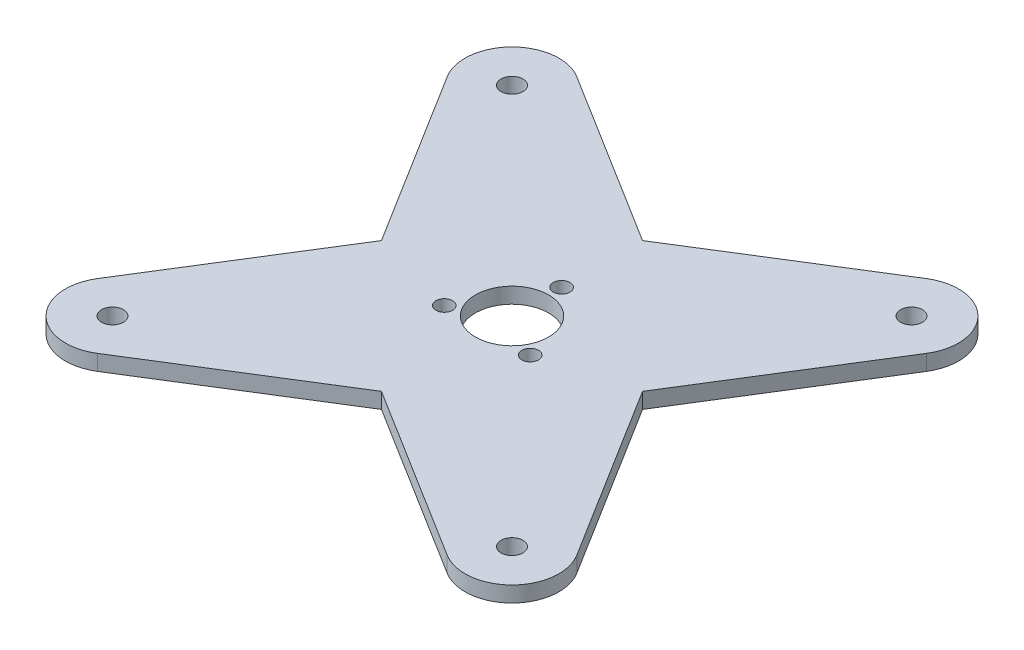
ISO-10303-21;
HEADER;
FILE_DESCRIPTION(('STEP AP214'),'2;1');
FILE_NAME('part.step','',(''),(''),'','','');
FILE_SCHEMA(('AUTOMOTIVE_DESIGN { 1 0 10303 214 1 1 1 1 }'));
ENDSEC;
DATA;
#1=APPLICATION_CONTEXT('core data for automotive mechanical design processes');
#2=APPLICATION_PROTOCOL_DEFINITION('international standard','automotive_design',2000,#1);
#3=PRODUCT_CONTEXT('',#1,'mechanical');
#4=PRODUCT('Part','Part','',(#3));
#5=PRODUCT_RELATED_PRODUCT_CATEGORY('part','',(#4));
#6=PRODUCT_DEFINITION_FORMATION('','',#4);
#7=PRODUCT_DEFINITION_CONTEXT('part definition',#1,'design');
#8=PRODUCT_DEFINITION('design','',#6,#7);
#9=PRODUCT_DEFINITION_SHAPE('','',#8);
#10=(LENGTH_UNIT() NAMED_UNIT(*) SI_UNIT(.MILLI.,.METRE.));
#11=(NAMED_UNIT(*) PLANE_ANGLE_UNIT() SI_UNIT($,.RADIAN.));
#12=(NAMED_UNIT(*) SI_UNIT($,.STERADIAN.) SOLID_ANGLE_UNIT());
#13=UNCERTAINTY_MEASURE_WITH_UNIT(LENGTH_MEASURE(1.E-05),#10,'distance_accuracy_value','');
#14=(GEOMETRIC_REPRESENTATION_CONTEXT(3) GLOBAL_UNCERTAINTY_ASSIGNED_CONTEXT((#13)) GLOBAL_UNIT_ASSIGNED_CONTEXT((#10,
#11,#12)) REPRESENTATION_CONTEXT('',''));
#15=CARTESIAN_POINT('',(0.,0.,0.));
#16=DIRECTION('',(0.,0.,1.));
#17=DIRECTION('',(1.,0.,0.));
#18=AXIS2_PLACEMENT_3D('',#15,#16,#17);
#19=CARTESIAN_POINT('',(-38.25,3.,-38.25));
#20=DIRECTION('',(0.,1.,0.));
#21=DIRECTION('',(0.,0.,1.));
#22=AXIS2_PLACEMENT_3D('',#19,#20,#21);
#23=PLANE('',#22);
#24=CARTESIAN_POINT('',(-8.22724133595217,3.,4.75));
#25=DIRECTION('',(0.,1.,0.));
#26=DIRECTION('',(0.,0.,1.));
#27=AXIS2_PLACEMENT_3D('',#24,#25,#26);
#28=CIRCLE('',#27,1.6);
#29=CARTESIAN_POINT('',(-8.22724133595217,3.,6.35000000000001));
#30=VERTEX_POINT('',#29);
#31=EDGE_CURVE('E340',#30,#30,#28,.T.);
#32=ORIENTED_EDGE('',*,*,#31,.F.);
#33=EDGE_LOOP('',(#32));
#34=FACE_BOUND('',#33,.T.);
#35=CARTESIAN_POINT('',(8.22724133595217,3.,4.75));
#36=DIRECTION('',(0.,1.,0.));
#37=DIRECTION('',(0.,0.,1.));
#38=AXIS2_PLACEMENT_3D('',#35,#36,#37);
#39=CIRCLE('',#38,1.6);
#40=CARTESIAN_POINT('',(8.22724133595217,3.,6.35));
#41=VERTEX_POINT('',#40);
#42=EDGE_CURVE('E336',#41,#41,#39,.T.);
#43=ORIENTED_EDGE('',*,*,#42,.F.);
#44=EDGE_LOOP('',(#43));
#45=FACE_BOUND('',#44,.T.);
#46=CARTESIAN_POINT('',(0.,3.,-9.5));
#47=DIRECTION('',(0.,1.,0.));
#48=DIRECTION('',(0.,0.,1.));
#49=AXIS2_PLACEMENT_3D('',#46,#47,#48);
#50=CIRCLE('',#49,1.6);
#51=CARTESIAN_POINT('',(0.,3.,-7.9));
#52=VERTEX_POINT('',#51);
#53=EDGE_CURVE('E329',#52,#52,#50,.T.);
#54=ORIENTED_EDGE('',*,*,#53,.F.);
#55=EDGE_LOOP('',(#54));
#56=FACE_BOUND('',#55,.T.);
#57=CARTESIAN_POINT('',(0.,3.,0.));
#58=DIRECTION('',(0.,1.,0.));
#59=DIRECTION('',(0.,0.,1.));
#60=AXIS2_PLACEMENT_3D('',#57,#58,#59);
#61=CIRCLE('',#60,7.);
#62=CARTESIAN_POINT('',(0.,3.,7.));
#63=VERTEX_POINT('',#62);
#64=EDGE_CURVE('E209',#63,#63,#61,.T.);
#65=ORIENTED_EDGE('',*,*,#64,.F.);
#66=EDGE_LOOP('',(#65));
#67=FACE_BOUND('',#66,.T.);
#68=CARTESIAN_POINT('',(38.25,3.,38.25));
#69=DIRECTION('',(0.,1.,0.));
#70=DIRECTION('',(0.,0.,1.));
#71=AXIS2_PLACEMENT_3D('',#68,#69,#70);
#72=CIRCLE('',#71,2.1);
#73=CARTESIAN_POINT('',(38.25,3.,40.35));
#74=VERTEX_POINT('',#73);
#75=EDGE_CURVE('E229',#74,#74,#72,.T.);
#76=ORIENTED_EDGE('',*,*,#75,.F.);
#77=EDGE_LOOP('',(#76));
#78=FACE_BOUND('',#77,.T.);
#79=CARTESIAN_POINT('',(38.25,3.,-38.25));
#80=DIRECTION('',(0.,1.,0.));
#81=DIRECTION('',(0.,0.,1.));
#82=AXIS2_PLACEMENT_3D('',#79,#80,#81);
#83=CIRCLE('',#82,2.1);
#84=CARTESIAN_POINT('',(38.25,3.,-36.15));
#85=VERTEX_POINT('',#84);
#86=EDGE_CURVE('E162',#85,#85,#83,.T.);
#87=ORIENTED_EDGE('',*,*,#86,.F.);
#88=EDGE_LOOP('',(#87));
#89=FACE_BOUND('',#88,.T.);
#90=CARTESIAN_POINT('',(-38.25,3.,-38.25));
#91=DIRECTION('',(0.,1.,0.));
#92=DIRECTION('',(0.,0.,1.));
#93=AXIS2_PLACEMENT_3D('',#90,#91,#92);
#94=CIRCLE('',#93,9.);
#95=CARTESIAN_POINT('',(-33.4870671074262,3.,-45.8863911804489));
#96=VERTEX_POINT('',#95);
#97=CARTESIAN_POINT('',(-45.8863911804489,3.,-33.4870671074262));
#98=VERTEX_POINT('',#97);
#99=EDGE_CURVE('E181',#96,#98,#94,.T.);
#100=ORIENTED_EDGE('',*,*,#99,.T.);
#101=DIRECTION('',(0.529214765841535,0.,0.848487908938772));
#102=VECTOR('',#101,1.);
#103=CARTESIAN_POINT('',(-45.8863911804489,3.,-33.4870671074262));
#104=LINE('',#103,#102);
#105=CARTESIAN_POINT('',(-25.,3.,0.));
#106=VERTEX_POINT('',#105);
#107=EDGE_CURVE('E109',#98,#106,#104,.T.);
#108=ORIENTED_EDGE('',*,*,#107,.T.);
#109=DIRECTION('',(-0.529214765841535,0.,0.848487908938772));
#110=VECTOR('',#109,1.);
#111=CARTESIAN_POINT('',(-45.8863911804489,3.,33.4870671074262));
#112=LINE('',#111,#110);
#113=CARTESIAN_POINT('',(-45.8863911804489,3.,33.4870671074262));
#114=VERTEX_POINT('',#113);
#115=EDGE_CURVE('E247',#106,#114,#112,.T.);
#116=ORIENTED_EDGE('',*,*,#115,.T.);
#117=CARTESIAN_POINT('',(-38.25,3.,38.25));
#118=DIRECTION('',(0.,1.,0.));
#119=DIRECTION('',(0.,0.,1.));
#120=AXIS2_PLACEMENT_3D('',#117,#118,#119);
#121=CIRCLE('',#120,9.);
#122=CARTESIAN_POINT('',(-33.4870671074262,3.,45.886391180449));
#123=VERTEX_POINT('',#122);
#124=EDGE_CURVE('E249',#114,#123,#121,.T.);
#125=ORIENTED_EDGE('',*,*,#124,.T.);
#126=DIRECTION('',(0.848487908938771,0.,-0.529214765841535));
#127=VECTOR('',#126,1.);
#128=CARTESIAN_POINT('',(-33.4870671074262,3.,45.886391180449));
#129=LINE('',#128,#127);
#130=CARTESIAN_POINT('',(0.,3.,25.));
#131=VERTEX_POINT('',#130);
#132=EDGE_CURVE('E251',#123,#131,#129,.T.);
#133=ORIENTED_EDGE('',*,*,#132,.T.);
#134=DIRECTION('',(0.848487908938772,0.,0.529214765841535));
#135=VECTOR('',#134,1.);
#136=CARTESIAN_POINT('',(33.4870671074262,3.,45.8863911804489));
#137=LINE('',#136,#135);
#138=CARTESIAN_POINT('',(33.4870671074262,3.,45.8863911804489));
#139=VERTEX_POINT('',#138);
#140=EDGE_CURVE('E253',#131,#139,#137,.T.);
#141=ORIENTED_EDGE('',*,*,#140,.T.);
#142=CARTESIAN_POINT('',(38.25,3.,38.25));
#143=DIRECTION('',(0.,1.,0.));
#144=DIRECTION('',(0.,0.,1.));
#145=AXIS2_PLACEMENT_3D('',#142,#143,#144);
#146=CIRCLE('',#145,9.);
#147=CARTESIAN_POINT('',(45.886391180449,3.,33.4870671074262));
#148=VERTEX_POINT('',#147);
#149=EDGE_CURVE('E255',#139,#148,#146,.T.);
#150=ORIENTED_EDGE('',*,*,#149,.T.);
#151=DIRECTION('',(-0.529214765841535,0.,-0.848487908938772));
#152=VECTOR('',#151,1.);
#153=CARTESIAN_POINT('',(45.886391180449,3.,33.4870671074262));
#154=LINE('',#153,#152);
#155=CARTESIAN_POINT('',(25.,3.,0.));
#156=VERTEX_POINT('',#155);
#157=EDGE_CURVE('E257',#148,#156,#154,.T.);
#158=ORIENTED_EDGE('',*,*,#157,.T.);
#159=DIRECTION('',(0.529214765841535,0.,-0.848487908938772));
#160=VECTOR('',#159,1.);
#161=CARTESIAN_POINT('',(45.886391180449,3.,-33.4870671074262));
#162=LINE('',#161,#160);
#163=CARTESIAN_POINT('',(45.8863911804489,3.,-33.4870671074262));
#164=VERTEX_POINT('',#163);
#165=EDGE_CURVE('E140',#156,#164,#162,.T.);
#166=ORIENTED_EDGE('',*,*,#165,.T.);
#167=CARTESIAN_POINT('',(38.25,3.,-38.25));
#168=DIRECTION('',(0.,1.,0.));
#169=DIRECTION('',(0.,0.,1.));
#170=AXIS2_PLACEMENT_3D('',#167,#168,#169);
#171=CIRCLE('',#170,9.);
#172=CARTESIAN_POINT('',(33.4870671074262,3.,-45.8863911804489));
#173=VERTEX_POINT('',#172);
#174=EDGE_CURVE('E134',#164,#173,#171,.T.);
#175=ORIENTED_EDGE('',*,*,#174,.T.);
#176=DIRECTION('',(-0.848487908938772,0.,0.529214765841535));
#177=VECTOR('',#176,1.);
#178=CARTESIAN_POINT('',(33.4870671074262,3.,-45.8863911804489));
#179=LINE('',#178,#177);
#180=CARTESIAN_POINT('',(0.,3.,-25.));
#181=VERTEX_POINT('',#180);
#182=EDGE_CURVE('E138',#173,#181,#179,.T.);
#183=ORIENTED_EDGE('',*,*,#182,.T.);
#184=DIRECTION('',(-0.848487908938772,0.,-0.529214765841535));
#185=VECTOR('',#184,1.);
#186=CARTESIAN_POINT('',(-33.4870671074262,3.,-45.8863911804489));
#187=LINE('',#186,#185);
#188=EDGE_CURVE('E54',#181,#96,#187,.T.);
#189=ORIENTED_EDGE('',*,*,#188,.T.);
#190=EDGE_LOOP('',(#100,#108,#116,#125,#133,#141,#150,#158,#166,#175,#183,#189));
#191=FACE_BOUND('',#190,.T.);
#192=CARTESIAN_POINT('',(-38.25,3.,38.25));
#193=DIRECTION('',(0.,1.,0.));
#194=DIRECTION('',(0.,0.,1.));
#195=AXIS2_PLACEMENT_3D('',#192,#193,#194);
#196=CIRCLE('',#195,2.1);
#197=CARTESIAN_POINT('',(-38.25,3.,40.35));
#198=VERTEX_POINT('',#197);
#199=EDGE_CURVE('E235',#198,#198,#196,.T.);
#200=ORIENTED_EDGE('',*,*,#199,.F.);
#201=EDGE_LOOP('',(#200));
#202=FACE_BOUND('',#201,.T.);
#203=CARTESIAN_POINT('',(-38.25,3.,-38.25));
#204=DIRECTION('',(0.,1.,0.));
#205=DIRECTION('',(0.,0.,1.));
#206=AXIS2_PLACEMENT_3D('',#203,#204,#205);
#207=CIRCLE('',#206,2.1);
#208=CARTESIAN_POINT('',(-38.25,3.,-36.15));
#209=VERTEX_POINT('',#208);
#210=EDGE_CURVE('E220',#209,#209,#207,.T.);
#211=ORIENTED_EDGE('',*,*,#210,.F.);
#212=EDGE_LOOP('',(#211));
#213=FACE_BOUND('',#212,.T.);
#214=ADVANCED_FACE('F35',(#34,#45,#56,#67,#78,#89,#191,#202,#213),#23,.T.);
#215=CARTESIAN_POINT('',(-38.25,0.,-38.25));
#216=DIRECTION('',(0.,1.,0.));
#217=DIRECTION('',(0.,0.,1.));
#218=AXIS2_PLACEMENT_3D('',#215,#216,#217);
#219=PLANE('',#218);
#220=CARTESIAN_POINT('',(-8.22724133595217,0.,4.75));
#221=DIRECTION('',(0.,1.,0.));
#222=DIRECTION('',(0.,0.,1.));
#223=AXIS2_PLACEMENT_3D('',#220,#221,#222);
#224=CIRCLE('',#223,1.6);
#225=CARTESIAN_POINT('',(-8.22724133595217,0.,6.35000000000001));
#226=VERTEX_POINT('',#225);
#227=EDGE_CURVE('E39',#226,#226,#224,.T.);
#228=ORIENTED_EDGE('',*,*,#227,.T.);
#229=EDGE_LOOP('',(#228));
#230=FACE_BOUND('',#229,.T.);
#231=CARTESIAN_POINT('',(8.22724133595217,0.,4.75));
#232=DIRECTION('',(0.,1.,0.));
#233=DIRECTION('',(0.,0.,1.));
#234=AXIS2_PLACEMENT_3D('',#231,#232,#233);
#235=CIRCLE('',#234,1.6);
#236=CARTESIAN_POINT('',(8.22724133595217,0.,6.35));
#237=VERTEX_POINT('',#236);
#238=EDGE_CURVE('E211',#237,#237,#235,.T.);
#239=ORIENTED_EDGE('',*,*,#238,.T.);
#240=EDGE_LOOP('',(#239));
#241=FACE_BOUND('',#240,.T.);
#242=CARTESIAN_POINT('',(0.,0.,-9.5));
#243=DIRECTION('',(0.,1.,0.));
#244=DIRECTION('',(0.,0.,1.));
#245=AXIS2_PLACEMENT_3D('',#242,#243,#244);
#246=CIRCLE('',#245,1.6);
#247=CARTESIAN_POINT('',(0.,0.,-7.9));
#248=VERTEX_POINT('',#247);
#249=EDGE_CURVE('E208',#248,#248,#246,.T.);
#250=ORIENTED_EDGE('',*,*,#249,.T.);
#251=EDGE_LOOP('',(#250));
#252=FACE_BOUND('',#251,.T.);
#253=CARTESIAN_POINT('',(0.,0.,0.));
#254=DIRECTION('',(0.,1.,0.));
#255=DIRECTION('',(0.,0.,1.));
#256=AXIS2_PLACEMENT_3D('',#253,#254,#255);
#257=CIRCLE('',#256,7.);
#258=CARTESIAN_POINT('',(0.,0.,7.));
#259=VERTEX_POINT('',#258);
#260=EDGE_CURVE('E205',#259,#259,#257,.T.);
#261=ORIENTED_EDGE('',*,*,#260,.T.);
#262=EDGE_LOOP('',(#261));
#263=FACE_BOUND('',#262,.T.);
#264=CARTESIAN_POINT('',(-38.25,0.,-38.25));
#265=DIRECTION('',(0.,1.,0.));
#266=DIRECTION('',(0.,0.,1.));
#267=AXIS2_PLACEMENT_3D('',#264,#265,#266);
#268=CIRCLE('',#267,9.);
#269=CARTESIAN_POINT('',(-33.4870671074262,0.,-45.8863911804489));
#270=VERTEX_POINT('',#269);
#271=CARTESIAN_POINT('',(-45.8863911804489,0.,-33.4870671074262));
#272=VERTEX_POINT('',#271);
#273=EDGE_CURVE('E158',#270,#272,#268,.T.);
#274=ORIENTED_EDGE('',*,*,#273,.F.);
#275=DIRECTION('',(-0.848487908938772,0.,-0.529214765841535));
#276=VECTOR('',#275,1.);
#277=CARTESIAN_POINT('',(-33.4870671074262,0.,-45.8863911804489));
#278=LINE('',#277,#276);
#279=CARTESIAN_POINT('',(0.,0.,-25.));
#280=VERTEX_POINT('',#279);
#281=EDGE_CURVE('E101',#280,#270,#278,.T.);
#282=ORIENTED_EDGE('',*,*,#281,.F.);
#283=DIRECTION('',(-0.848487908938772,0.,0.529214765841535));
#284=VECTOR('',#283,1.);
#285=CARTESIAN_POINT('',(33.4870671074262,0.,-45.8863911804489));
#286=LINE('',#285,#284);
#287=CARTESIAN_POINT('',(33.4870671074262,0.,-45.8863911804489));
#288=VERTEX_POINT('',#287);
#289=EDGE_CURVE('E95',#288,#280,#286,.T.);
#290=ORIENTED_EDGE('',*,*,#289,.F.);
#291=CARTESIAN_POINT('',(38.25,0.,-38.25));
#292=DIRECTION('',(0.,1.,0.));
#293=DIRECTION('',(0.,0.,1.));
#294=AXIS2_PLACEMENT_3D('',#291,#292,#293);
#295=CIRCLE('',#294,9.);
#296=CARTESIAN_POINT('',(45.8863911804489,0.,-33.4870671074262));
#297=VERTEX_POINT('',#296);
#298=EDGE_CURVE('E148',#297,#288,#295,.T.);
#299=ORIENTED_EDGE('',*,*,#298,.F.);
#300=DIRECTION('',(0.529214765841535,0.,-0.848487908938772));
#301=VECTOR('',#300,1.);
#302=CARTESIAN_POINT('',(45.886391180449,0.,-33.4870671074262));
#303=LINE('',#302,#301);
#304=CARTESIAN_POINT('',(25.,0.,0.));
#305=VERTEX_POINT('',#304);
#306=EDGE_CURVE('E176',#305,#297,#303,.T.);
#307=ORIENTED_EDGE('',*,*,#306,.F.);
#308=DIRECTION('',(-0.529214765841535,0.,-0.848487908938772));
#309=VECTOR('',#308,1.);
#310=CARTESIAN_POINT('',(45.886391180449,0.,33.4870671074262));
#311=LINE('',#310,#309);
#312=CARTESIAN_POINT('',(45.886391180449,0.,33.4870671074262));
#313=VERTEX_POINT('',#312);
#314=EDGE_CURVE('E174',#313,#305,#311,.T.);
#315=ORIENTED_EDGE('',*,*,#314,.F.);
#316=CARTESIAN_POINT('',(38.25,0.,38.25));
#317=DIRECTION('',(0.,1.,0.));
#318=DIRECTION('',(0.,0.,1.));
#319=AXIS2_PLACEMENT_3D('',#316,#317,#318);
#320=CIRCLE('',#319,9.);
#321=CARTESIAN_POINT('',(33.4870671074262,0.,45.8863911804489));
#322=VERTEX_POINT('',#321);
#323=EDGE_CURVE('E172',#322,#313,#320,.T.);
#324=ORIENTED_EDGE('',*,*,#323,.F.);
#325=DIRECTION('',(0.848487908938772,0.,0.529214765841535));
#326=VECTOR('',#325,1.);
#327=CARTESIAN_POINT('',(33.4870671074262,0.,45.8863911804489));
#328=LINE('',#327,#326);
#329=CARTESIAN_POINT('',(0.,0.,25.));
#330=VERTEX_POINT('',#329);
#331=EDGE_CURVE('E170',#330,#322,#328,.T.);
#332=ORIENTED_EDGE('',*,*,#331,.F.);
#333=DIRECTION('',(0.848487908938771,0.,-0.529214765841535));
#334=VECTOR('',#333,1.);
#335=CARTESIAN_POINT('',(-33.4870671074262,0.,45.886391180449));
#336=LINE('',#335,#334);
#337=CARTESIAN_POINT('',(-33.4870671074262,0.,45.886391180449));
#338=VERTEX_POINT('',#337);
#339=EDGE_CURVE('E168',#338,#330,#336,.T.);
#340=ORIENTED_EDGE('',*,*,#339,.F.);
#341=CARTESIAN_POINT('',(-38.25,0.,38.25));
#342=DIRECTION('',(0.,1.,0.));
#343=DIRECTION('',(0.,0.,1.));
#344=AXIS2_PLACEMENT_3D('',#341,#342,#343);
#345=CIRCLE('',#344,9.);
#346=CARTESIAN_POINT('',(-45.8863911804489,0.,33.4870671074262));
#347=VERTEX_POINT('',#346);
#348=EDGE_CURVE('E166',#347,#338,#345,.T.);
#349=ORIENTED_EDGE('',*,*,#348,.F.);
#350=DIRECTION('',(-0.529214765841535,0.,0.848487908938772));
#351=VECTOR('',#350,1.);
#352=CARTESIAN_POINT('',(-45.8863911804489,0.,33.4870671074262));
#353=LINE('',#352,#351);
#354=CARTESIAN_POINT('',(-25.,0.,0.));
#355=VERTEX_POINT('',#354);
#356=EDGE_CURVE('E164',#355,#347,#353,.T.);
#357=ORIENTED_EDGE('',*,*,#356,.F.);
#358=DIRECTION('',(0.529214765841535,0.,0.848487908938772));
#359=VECTOR('',#358,1.);
#360=CARTESIAN_POINT('',(-45.8863911804489,0.,-33.4870671074262));
#361=LINE('',#360,#359);
#362=EDGE_CURVE('E161',#272,#355,#361,.T.);
#363=ORIENTED_EDGE('',*,*,#362,.F.);
#364=EDGE_LOOP('',(#274,#282,#290,#299,#307,#315,#324,#332,#340,#349,#357,#363));
#365=FACE_BOUND('',#364,.T.);
#366=CARTESIAN_POINT('',(38.25,0.,-38.25));
#367=DIRECTION('',(0.,1.,0.));
#368=DIRECTION('',(0.,0.,1.));
#369=AXIS2_PLACEMENT_3D('',#366,#367,#368);
#370=CIRCLE('',#369,2.1);
#371=CARTESIAN_POINT('',(38.25,0.,-36.15));
#372=VERTEX_POINT('',#371);
#373=EDGE_CURVE('E238',#372,#372,#370,.T.);
#374=ORIENTED_EDGE('',*,*,#373,.T.);
#375=EDGE_LOOP('',(#374));
#376=FACE_BOUND('',#375,.T.);
#377=CARTESIAN_POINT('',(-38.25,0.,38.25));
#378=DIRECTION('',(0.,1.,0.));
#379=DIRECTION('',(0.,0.,1.));
#380=AXIS2_PLACEMENT_3D('',#377,#378,#379);
#381=CIRCLE('',#380,2.1);
#382=CARTESIAN_POINT('',(-38.25,0.,40.35));
#383=VERTEX_POINT('',#382);
#384=EDGE_CURVE('E232',#383,#383,#381,.T.);
#385=ORIENTED_EDGE('',*,*,#384,.T.);
#386=EDGE_LOOP('',(#385));
#387=FACE_BOUND('',#386,.T.);
#388=CARTESIAN_POINT('',(38.25,0.,38.25));
#389=DIRECTION('',(0.,1.,0.));
#390=DIRECTION('',(0.,0.,1.));
#391=AXIS2_PLACEMENT_3D('',#388,#389,#390);
#392=CIRCLE('',#391,2.1);
#393=CARTESIAN_POINT('',(38.25,0.,40.35));
#394=VERTEX_POINT('',#393);
#395=EDGE_CURVE('E225',#394,#394,#392,.T.);
#396=ORIENTED_EDGE('',*,*,#395,.T.);
#397=EDGE_LOOP('',(#396));
#398=FACE_BOUND('',#397,.T.);
#399=CARTESIAN_POINT('',(-38.25,0.,-38.25));
#400=DIRECTION('',(0.,1.,0.));
#401=DIRECTION('',(0.,0.,1.));
#402=AXIS2_PLACEMENT_3D('',#399,#400,#401);
#403=CIRCLE('',#402,2.1);
#404=CARTESIAN_POINT('',(-38.25,0.,-36.15));
#405=VERTEX_POINT('',#404);
#406=EDGE_CURVE('E216',#405,#405,#403,.T.);
#407=ORIENTED_EDGE('',*,*,#406,.T.);
#408=EDGE_LOOP('',(#407));
#409=FACE_BOUND('',#408,.T.);
#410=ADVANCED_FACE('F270',(#230,#241,#252,#263,#365,#376,#387,#398,#409),#219,.F.);
#411=CARTESIAN_POINT('',(-38.25,3.,-38.25));
#412=DIRECTION('',(0.,-1.,0.));
#413=DIRECTION('',(0.,0.,-1.));
#414=AXIS2_PLACEMENT_3D('',#411,#412,#413);
#415=CYLINDRICAL_SURFACE('',#414,9.);
#416=ORIENTED_EDGE('',*,*,#273,.T.);
#417=DIRECTION('',(0.,-1.,0.));
#418=VECTOR('',#417,1.);
#419=CARTESIAN_POINT('',(-45.8863911804489,3.,-33.4870671074262));
#420=LINE('',#419,#418);
#421=EDGE_CURVE('E11',#98,#272,#420,.T.);
#422=ORIENTED_EDGE('',*,*,#421,.F.);
#423=ORIENTED_EDGE('',*,*,#99,.F.);
#424=DIRECTION('',(0.,-1.,0.));
#425=VECTOR('',#424,1.);
#426=CARTESIAN_POINT('',(-33.4870671074262,3.,-45.8863911804489));
#427=LINE('',#426,#425);
#428=EDGE_CURVE('E154',#96,#270,#427,.T.);
#429=ORIENTED_EDGE('',*,*,#428,.T.);
#430=EDGE_LOOP('',(#416,#422,#423,#429));
#431=FACE_BOUND('',#430,.T.);
#432=ADVANCED_FACE('F37',(#431),#415,.T.);
#433=CARTESIAN_POINT('',(-45.8863911804489,3.,-33.4870671074262));
#434=DIRECTION('',(0.848487908938772,0.,-0.529214765841535));
#435=DIRECTION('',(-0.529214765841535,0.,-0.848487908938772));
#436=AXIS2_PLACEMENT_3D('',#433,#434,#435);
#437=PLANE('',#436);
#438=ORIENTED_EDGE('',*,*,#362,.T.);
#439=DIRECTION('',(0.,-1.,0.));
#440=VECTOR('',#439,1.);
#441=CARTESIAN_POINT('',(-25.,3.,0.));
#442=LINE('',#441,#440);
#443=EDGE_CURVE('E45',#106,#355,#442,.T.);
#444=ORIENTED_EDGE('',*,*,#443,.F.);
#445=ORIENTED_EDGE('',*,*,#107,.F.);
#446=ORIENTED_EDGE('',*,*,#421,.T.);
#447=EDGE_LOOP('',(#438,#444,#445,#446));
#448=FACE_BOUND('',#447,.T.);
#449=ADVANCED_FACE('F477',(#448),#437,.F.);
#450=CARTESIAN_POINT('',(-45.8863911804489,3.,33.4870671074262));
#451=DIRECTION('',(0.848487908938771,0.,0.529214765841535));
#452=DIRECTION('',(0.529214765841535,0.,-0.848487908938772));
#453=AXIS2_PLACEMENT_3D('',#450,#451,#452);
#454=PLANE('',#453);
#455=ORIENTED_EDGE('',*,*,#356,.T.);
#456=DIRECTION('',(0.,-1.,0.));
#457=VECTOR('',#456,1.);
#458=CARTESIAN_POINT('',(-45.8863911804489,3.,33.4870671074262));
#459=LINE('',#458,#457);
#460=EDGE_CURVE('E200',#114,#347,#459,.T.);
#461=ORIENTED_EDGE('',*,*,#460,.F.);
#462=ORIENTED_EDGE('',*,*,#115,.F.);
#463=ORIENTED_EDGE('',*,*,#443,.T.);
#464=EDGE_LOOP('',(#455,#461,#462,#463));
#465=FACE_BOUND('',#464,.T.);
#466=ADVANCED_FACE('F468',(#465),#454,.F.);
#467=CARTESIAN_POINT('',(-38.25,3.,38.25));
#468=DIRECTION('',(0.,-1.,0.));
#469=DIRECTION('',(0.,0.,-1.));
#470=AXIS2_PLACEMENT_3D('',#467,#468,#469);
#471=CYLINDRICAL_SURFACE('',#470,9.);
#472=ORIENTED_EDGE('',*,*,#348,.T.);
#473=DIRECTION('',(0.,-1.,0.));
#474=VECTOR('',#473,1.);
#475=CARTESIAN_POINT('',(-33.4870671074262,3.,45.886391180449));
#476=LINE('',#475,#474);
#477=EDGE_CURVE('E197',#123,#338,#476,.T.);
#478=ORIENTED_EDGE('',*,*,#477,.F.);
#479=ORIENTED_EDGE('',*,*,#124,.F.);
#480=ORIENTED_EDGE('',*,*,#460,.T.);
#481=EDGE_LOOP('',(#472,#478,#479,#480));
#482=FACE_BOUND('',#481,.T.);
#483=ADVANCED_FACE('F459',(#482),#471,.T.);
#484=CARTESIAN_POINT('',(-33.4870671074262,3.,45.886391180449));
#485=DIRECTION('',(-0.529214765841535,0.,-0.848487908938771));
#486=DIRECTION('',(-0.848487908938771,0.,0.529214765841535));
#487=AXIS2_PLACEMENT_3D('',#484,#485,#486);
#488=PLANE('',#487);
#489=ORIENTED_EDGE('',*,*,#339,.T.);
#490=DIRECTION('',(0.,-1.,0.));
#491=VECTOR('',#490,1.);
#492=CARTESIAN_POINT('',(0.,3.,25.));
#493=LINE('',#492,#491);
#494=EDGE_CURVE('E194',#131,#330,#493,.T.);
#495=ORIENTED_EDGE('',*,*,#494,.F.);
#496=ORIENTED_EDGE('',*,*,#132,.F.);
#497=ORIENTED_EDGE('',*,*,#477,.T.);
#498=EDGE_LOOP('',(#489,#495,#496,#497));
#499=FACE_BOUND('',#498,.T.);
#500=ADVANCED_FACE('F450',(#499),#488,.F.);
#501=CARTESIAN_POINT('',(33.4870671074262,3.,45.8863911804489));
#502=DIRECTION('',(0.529214765841535,0.,-0.848487908938772));
#503=DIRECTION('',(-0.848487908938772,0.,-0.529214765841535));
#504=AXIS2_PLACEMENT_3D('',#501,#502,#503);
#505=PLANE('',#504);
#506=ORIENTED_EDGE('',*,*,#331,.T.);
#507=DIRECTION('',(0.,-1.,0.));
#508=VECTOR('',#507,1.);
#509=CARTESIAN_POINT('',(33.4870671074262,3.,45.8863911804489));
#510=LINE('',#509,#508);
#511=EDGE_CURVE('E191',#139,#322,#510,.T.);
#512=ORIENTED_EDGE('',*,*,#511,.F.);
#513=ORIENTED_EDGE('',*,*,#140,.F.);
#514=ORIENTED_EDGE('',*,*,#494,.T.);
#515=EDGE_LOOP('',(#506,#512,#513,#514));
#516=FACE_BOUND('',#515,.T.);
#517=ADVANCED_FACE('F441',(#516),#505,.F.);
#518=CARTESIAN_POINT('',(38.25,3.,38.25));
#519=DIRECTION('',(0.,-1.,0.));
#520=DIRECTION('',(0.,0.,-1.));
#521=AXIS2_PLACEMENT_3D('',#518,#519,#520);
#522=CYLINDRICAL_SURFACE('',#521,9.);
#523=ORIENTED_EDGE('',*,*,#323,.T.);
#524=DIRECTION('',(0.,-1.,0.));
#525=VECTOR('',#524,1.);
#526=CARTESIAN_POINT('',(45.886391180449,3.,33.4870671074262));
#527=LINE('',#526,#525);
#528=EDGE_CURVE('E188',#148,#313,#527,.T.);
#529=ORIENTED_EDGE('',*,*,#528,.F.);
#530=ORIENTED_EDGE('',*,*,#149,.F.);
#531=ORIENTED_EDGE('',*,*,#511,.T.);
#532=EDGE_LOOP('',(#523,#529,#530,#531));
#533=FACE_BOUND('',#532,.T.);
#534=ADVANCED_FACE('F433',(#533),#522,.T.);
#535=CARTESIAN_POINT('',(45.886391180449,3.,33.4870671074262));
#536=DIRECTION('',(-0.848487908938772,0.,0.529214765841535));
#537=DIRECTION('',(0.529214765841535,0.,0.848487908938772));
#538=AXIS2_PLACEMENT_3D('',#535,#536,#537);
#539=PLANE('',#538);
#540=ORIENTED_EDGE('',*,*,#314,.T.);
#541=DIRECTION('',(0.,-1.,0.));
#542=VECTOR('',#541,1.);
#543=CARTESIAN_POINT('',(25.,3.,0.));
#544=LINE('',#543,#542);
#545=EDGE_CURVE('E185',#156,#305,#544,.T.);
#546=ORIENTED_EDGE('',*,*,#545,.F.);
#547=ORIENTED_EDGE('',*,*,#157,.F.);
#548=ORIENTED_EDGE('',*,*,#528,.T.);
#549=EDGE_LOOP('',(#540,#546,#547,#548));
#550=FACE_BOUND('',#549,.T.);
#551=ADVANCED_FACE('F263',(#550),#539,.F.);
#552=CARTESIAN_POINT('',(45.886391180449,3.,-33.4870671074262));
#553=DIRECTION('',(-0.848487908938772,0.,-0.529214765841535));
#554=DIRECTION('',(-0.529214765841535,0.,0.848487908938772));
#555=AXIS2_PLACEMENT_3D('',#552,#553,#554);
#556=PLANE('',#555);
#557=ORIENTED_EDGE('',*,*,#306,.T.);
#558=DIRECTION('',(0.,-1.,0.));
#559=VECTOR('',#558,1.);
#560=CARTESIAN_POINT('',(45.8863911804489,3.,-33.4870671074262));
#561=LINE('',#560,#559);
#562=EDGE_CURVE('E149',#164,#297,#561,.T.);
#563=ORIENTED_EDGE('',*,*,#562,.F.);
#564=ORIENTED_EDGE('',*,*,#165,.F.);
#565=ORIENTED_EDGE('',*,*,#545,.T.);
#566=EDGE_LOOP('',(#557,#563,#564,#565));
#567=FACE_BOUND('',#566,.T.);
#568=ADVANCED_FACE('F267',(#567),#556,.F.);
#569=CARTESIAN_POINT('',(38.25,3.,-38.25));
#570=DIRECTION('',(0.,-1.,0.));
#571=DIRECTION('',(0.,0.,-1.));
#572=AXIS2_PLACEMENT_3D('',#569,#570,#571);
#573=CYLINDRICAL_SURFACE('',#572,9.);
#574=ORIENTED_EDGE('',*,*,#298,.T.);
#575=DIRECTION('',(0.,-1.,0.));
#576=VECTOR('',#575,1.);
#577=CARTESIAN_POINT('',(33.4870671074262,3.,-45.8863911804489));
#578=LINE('',#577,#576);
#579=EDGE_CURVE('E145',#173,#288,#578,.T.);
#580=ORIENTED_EDGE('',*,*,#579,.F.);
#581=ORIENTED_EDGE('',*,*,#174,.F.);
#582=ORIENTED_EDGE('',*,*,#562,.T.);
#583=EDGE_LOOP('',(#574,#580,#581,#582));
#584=FACE_BOUND('',#583,.T.);
#585=ADVANCED_FACE('F146',(#584),#573,.T.);
#586=CARTESIAN_POINT('',(33.4870671074262,3.,-45.8863911804489));
#587=DIRECTION('',(0.529214765841535,0.,0.848487908938771));
#588=DIRECTION('',(0.848487908938772,0.,-0.529214765841535));
#589=AXIS2_PLACEMENT_3D('',#586,#587,#588);
#590=PLANE('',#589);
#591=ORIENTED_EDGE('',*,*,#289,.T.);
#592=DIRECTION('',(0.,-1.,0.));
#593=VECTOR('',#592,1.);
#594=CARTESIAN_POINT('',(0.,3.,-25.));
#595=LINE('',#594,#593);
#596=EDGE_CURVE('E150',#181,#280,#595,.T.);
#597=ORIENTED_EDGE('',*,*,#596,.F.);
#598=ORIENTED_EDGE('',*,*,#182,.F.);
#599=ORIENTED_EDGE('',*,*,#579,.T.);
#600=EDGE_LOOP('',(#591,#597,#598,#599));
#601=FACE_BOUND('',#600,.T.);
#602=ADVANCED_FACE('F152',(#601),#590,.F.);
#603=CARTESIAN_POINT('',(-33.4870671074262,3.,-45.8863911804489));
#604=DIRECTION('',(-0.529214765841535,0.,0.848487908938772));
#605=DIRECTION('',(0.848487908938772,0.,0.529214765841535));
#606=AXIS2_PLACEMENT_3D('',#603,#604,#605);
#607=PLANE('',#606);
#608=ORIENTED_EDGE('',*,*,#281,.T.);
#609=ORIENTED_EDGE('',*,*,#428,.F.);
#610=ORIENTED_EDGE('',*,*,#188,.F.);
#611=ORIENTED_EDGE('',*,*,#596,.T.);
#612=EDGE_LOOP('',(#608,#609,#610,#611));
#613=FACE_BOUND('',#612,.T.);
#614=ADVANCED_FACE('F276',(#613),#607,.F.);
#615=CARTESIAN_POINT('',(38.25,3.,-38.25));
#616=DIRECTION('',(0.,-1.,0.));
#617=DIRECTION('',(0.,0.,-1.));
#618=AXIS2_PLACEMENT_3D('',#615,#616,#617);
#619=CYLINDRICAL_SURFACE('',#618,2.1);
#620=ORIENTED_EDGE('',*,*,#86,.T.);
#621=EDGE_LOOP('',(#620));
#622=FACE_BOUND('',#621,.T.);
#623=ORIENTED_EDGE('',*,*,#373,.F.);
#624=EDGE_LOOP('',(#623));
#625=FACE_BOUND('',#624,.T.);
#626=ADVANCED_FACE('F278',(#622,#625),#619,.F.);
#627=CARTESIAN_POINT('',(-38.25,3.,38.25));
#628=DIRECTION('',(0.,-1.,0.));
#629=DIRECTION('',(0.,0.,-1.));
#630=AXIS2_PLACEMENT_3D('',#627,#628,#629);
#631=CYLINDRICAL_SURFACE('',#630,2.1);
#632=ORIENTED_EDGE('',*,*,#199,.T.);
#633=EDGE_LOOP('',(#632));
#634=FACE_BOUND('',#633,.T.);
#635=ORIENTED_EDGE('',*,*,#384,.F.);
#636=EDGE_LOOP('',(#635));
#637=FACE_BOUND('',#636,.T.);
#638=ADVANCED_FACE('F284',(#634,#637),#631,.F.);
#639=CARTESIAN_POINT('',(38.25,3.,38.25));
#640=DIRECTION('',(0.,-1.,0.));
#641=DIRECTION('',(0.,0.,-1.));
#642=AXIS2_PLACEMENT_3D('',#639,#640,#641);
#643=CYLINDRICAL_SURFACE('',#642,2.1);
#644=ORIENTED_EDGE('',*,*,#75,.T.);
#645=EDGE_LOOP('',(#644));
#646=FACE_BOUND('',#645,.T.);
#647=ORIENTED_EDGE('',*,*,#395,.F.);
#648=EDGE_LOOP('',(#647));
#649=FACE_BOUND('',#648,.T.);
#650=ADVANCED_FACE('F300',(#646,#649),#643,.F.);
#651=CARTESIAN_POINT('',(-38.25,3.,-38.25));
#652=DIRECTION('',(0.,-1.,0.));
#653=DIRECTION('',(0.,0.,-1.));
#654=AXIS2_PLACEMENT_3D('',#651,#652,#653);
#655=CYLINDRICAL_SURFACE('',#654,2.1);
#656=ORIENTED_EDGE('',*,*,#210,.T.);
#657=EDGE_LOOP('',(#656));
#658=FACE_BOUND('',#657,.T.);
#659=ORIENTED_EDGE('',*,*,#406,.F.);
#660=EDGE_LOOP('',(#659));
#661=FACE_BOUND('',#660,.T.);
#662=ADVANCED_FACE('F304',(#658,#661),#655,.F.);
#663=CARTESIAN_POINT('',(0.,-7.,0.));
#664=DIRECTION('',(0.,1.,0.));
#665=DIRECTION('',(0.,0.,1.));
#666=AXIS2_PLACEMENT_3D('',#663,#664,#665);
#667=CYLINDRICAL_SURFACE('',#666,7.);
#668=ORIENTED_EDGE('',*,*,#64,.T.);
#669=EDGE_LOOP('',(#668));
#670=FACE_BOUND('',#669,.T.);
#671=ORIENTED_EDGE('',*,*,#260,.F.);
#672=EDGE_LOOP('',(#671));
#673=FACE_BOUND('',#672,.T.);
#674=ADVANCED_FACE('F308',(#670,#673),#667,.F.);
#675=CARTESIAN_POINT('',(0.,-7.,-9.5));
#676=DIRECTION('',(0.,1.,0.));
#677=DIRECTION('',(0.,0.,1.));
#678=AXIS2_PLACEMENT_3D('',#675,#676,#677);
#679=CYLINDRICAL_SURFACE('',#678,1.6);
#680=ORIENTED_EDGE('',*,*,#53,.T.);
#681=EDGE_LOOP('',(#680));
#682=FACE_BOUND('',#681,.T.);
#683=ORIENTED_EDGE('',*,*,#249,.F.);
#684=EDGE_LOOP('',(#683));
#685=FACE_BOUND('',#684,.T.);
#686=ADVANCED_FACE('F312',(#682,#685),#679,.F.);
#687=CARTESIAN_POINT('',(8.22724133595217,-7.,4.75));
#688=DIRECTION('',(0.,1.,0.));
#689=DIRECTION('',(0.,0.,1.));
#690=AXIS2_PLACEMENT_3D('',#687,#688,#689);
#691=CYLINDRICAL_SURFACE('',#690,1.6);
#692=ORIENTED_EDGE('',*,*,#42,.T.);
#693=EDGE_LOOP('',(#692));
#694=FACE_BOUND('',#693,.T.);
#695=ORIENTED_EDGE('',*,*,#238,.F.);
#696=EDGE_LOOP('',(#695));
#697=FACE_BOUND('',#696,.T.);
#698=ADVANCED_FACE('F317',(#694,#697),#691,.F.);
#699=CARTESIAN_POINT('',(-8.22724133595217,-7.,4.75));
#700=DIRECTION('',(0.,1.,0.));
#701=DIRECTION('',(0.,0.,1.));
#702=AXIS2_PLACEMENT_3D('',#699,#700,#701);
#703=CYLINDRICAL_SURFACE('',#702,1.6);
#704=ORIENTED_EDGE('',*,*,#31,.T.);
#705=EDGE_LOOP('',(#704));
#706=FACE_BOUND('',#705,.T.);
#707=ORIENTED_EDGE('',*,*,#227,.F.);
#708=EDGE_LOOP('',(#707));
#709=FACE_BOUND('',#708,.T.);
#710=ADVANCED_FACE('F314',(#706,#709),#703,.F.);
#711=CLOSED_SHELL('',(#214,#410,#432,#449,#466,#483,#500,#517,#534,#551,#568,#585,#602,#614,
#626,#638,#650,#662,#674,#686,#698,#710));
#712=MANIFOLD_SOLID_BREP('B2',#711);
#713=ADVANCED_BREP_SHAPE_REPRESENTATION('',(#18,#712),#14);
#714=SHAPE_DEFINITION_REPRESENTATION(#9,#713);
ENDSEC;
END-ISO-10303-21;
